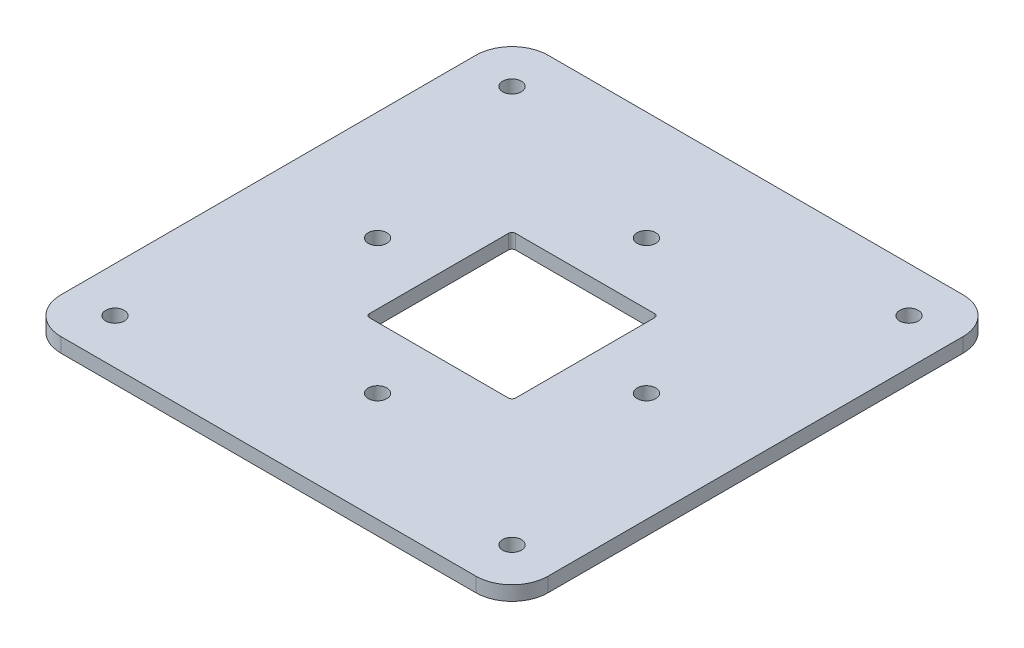
ISO-10303-21;
HEADER;
FILE_DESCRIPTION(('STEP AP214'),'2;1');
FILE_NAME('part.step','',(''),(''),'','','');
FILE_SCHEMA(('AUTOMOTIVE_DESIGN { 1 0 10303 214 1 1 1 1 }'));
ENDSEC;
DATA;
#1=APPLICATION_CONTEXT('core data for automotive mechanical design processes');
#2=APPLICATION_PROTOCOL_DEFINITION('international standard','automotive_design',2000,#1);
#3=PRODUCT_CONTEXT('',#1,'mechanical');
#4=PRODUCT('Part','Part','',(#3));
#5=PRODUCT_RELATED_PRODUCT_CATEGORY('part','',(#4));
#6=PRODUCT_DEFINITION_FORMATION('','',#4);
#7=PRODUCT_DEFINITION_CONTEXT('part definition',#1,'design');
#8=PRODUCT_DEFINITION('design','',#6,#7);
#9=PRODUCT_DEFINITION_SHAPE('','',#8);
#10=(LENGTH_UNIT() NAMED_UNIT(*) SI_UNIT(.MILLI.,.METRE.));
#11=(NAMED_UNIT(*) PLANE_ANGLE_UNIT() SI_UNIT($,.RADIAN.));
#12=(NAMED_UNIT(*) SI_UNIT($,.STERADIAN.) SOLID_ANGLE_UNIT());
#13=UNCERTAINTY_MEASURE_WITH_UNIT(LENGTH_MEASURE(1.E-05),#10,'distance_accuracy_value','');
#14=(GEOMETRIC_REPRESENTATION_CONTEXT(3) GLOBAL_UNCERTAINTY_ASSIGNED_CONTEXT((#13)) GLOBAL_UNIT_ASSIGNED_CONTEXT((#10,
#11,#12)) REPRESENTATION_CONTEXT('',''));
#15=CARTESIAN_POINT('',(0.,0.,0.));
#16=DIRECTION('',(0.,0.,1.));
#17=DIRECTION('',(1.,0.,0.));
#18=AXIS2_PLACEMENT_3D('',#15,#16,#17);
#19=CARTESIAN_POINT('',(67.5,4.,-67.5));
#20=DIRECTION('',(-1.,0.,0.));
#21=DIRECTION('',(0.,0.,1.));
#22=AXIS2_PLACEMENT_3D('',#19,#20,#21);
#23=PLANE('',#22);
#24=DIRECTION('',(0.,0.,-1.));
#25=VECTOR('',#24,1.);
#26=CARTESIAN_POINT('',(67.5,0.,-67.5));
#27=LINE('',#26,#25);
#28=CARTESIAN_POINT('',(67.5,0.,57.5));
#29=VERTEX_POINT('',#28);
#30=CARTESIAN_POINT('',(67.5,0.,-57.5));
#31=VERTEX_POINT('',#30);
#32=EDGE_CURVE('E240',#29,#31,#27,.T.);
#33=ORIENTED_EDGE('',*,*,#32,.T.);
#34=DIRECTION('',(0.,-1.,0.));
#35=VECTOR('',#34,1.);
#36=CARTESIAN_POINT('',(67.5,4.,-57.5));
#37=LINE('',#36,#35);
#38=CARTESIAN_POINT('',(67.5,4.,-57.5));
#39=VERTEX_POINT('',#38);
#40=EDGE_CURVE('E309',#31,#39,#37,.F.);
#41=ORIENTED_EDGE('',*,*,#40,.T.);
#42=DIRECTION('',(0.,0.,-1.));
#43=VECTOR('',#42,1.);
#44=CARTESIAN_POINT('',(67.5,4.,-67.5));
#45=LINE('',#44,#43);
#46=CARTESIAN_POINT('',(67.5,4.,57.5));
#47=VERTEX_POINT('',#46);
#48=EDGE_CURVE('E258',#47,#39,#45,.T.);
#49=ORIENTED_EDGE('',*,*,#48,.F.);
#50=DIRECTION('',(0.,-1.,0.));
#51=VECTOR('',#50,1.);
#52=CARTESIAN_POINT('',(67.5,4.,57.5));
#53=LINE('',#52,#51);
#54=EDGE_CURVE('E305',#47,#29,#53,.T.);
#55=ORIENTED_EDGE('',*,*,#54,.T.);
#56=EDGE_LOOP('',(#33,#41,#49,#55));
#57=FACE_BOUND('',#56,.T.);
#58=ADVANCED_FACE('F39',(#57),#23,.F.);
#59=CARTESIAN_POINT('',(-67.5,4.,-67.5));
#60=DIRECTION('',(0.,0.,1.));
#61=DIRECTION('',(1.,0.,0.));
#62=AXIS2_PLACEMENT_3D('',#59,#60,#61);
#63=PLANE('',#62);
#64=DIRECTION('',(-1.,0.,0.));
#65=VECTOR('',#64,1.);
#66=CARTESIAN_POINT('',(-67.5,4.,-67.5));
#67=LINE('',#66,#65);
#68=CARTESIAN_POINT('',(57.5,4.,-67.5));
#69=VERTEX_POINT('',#68);
#70=CARTESIAN_POINT('',(-57.5,4.,-67.5));
#71=VERTEX_POINT('',#70);
#72=EDGE_CURVE('E262',#69,#71,#67,.T.);
#73=ORIENTED_EDGE('',*,*,#72,.F.);
#74=DIRECTION('',(0.,-1.,0.));
#75=VECTOR('',#74,1.);
#76=CARTESIAN_POINT('',(57.5,4.,-67.5));
#77=LINE('',#76,#75);
#78=CARTESIAN_POINT('',(57.5,0.,-67.5));
#79=VERTEX_POINT('',#78);
#80=EDGE_CURVE('E289',#69,#79,#77,.T.);
#81=ORIENTED_EDGE('',*,*,#80,.T.);
#82=DIRECTION('',(-1.,0.,0.));
#83=VECTOR('',#82,1.);
#84=CARTESIAN_POINT('',(-67.5,0.,-67.5));
#85=LINE('',#84,#83);
#86=CARTESIAN_POINT('',(-57.5,0.,-67.5));
#87=VERTEX_POINT('',#86);
#88=EDGE_CURVE('E277',#79,#87,#85,.T.);
#89=ORIENTED_EDGE('',*,*,#88,.T.);
#90=DIRECTION('',(0.,-1.,0.));
#91=VECTOR('',#90,1.);
#92=CARTESIAN_POINT('',(-57.5,4.,-67.5));
#93=LINE('',#92,#91);
#94=EDGE_CURVE('E273',#87,#71,#93,.F.);
#95=ORIENTED_EDGE('',*,*,#94,.T.);
#96=EDGE_LOOP('',(#73,#81,#89,#95));
#97=FACE_BOUND('',#96,.T.);
#98=ADVANCED_FACE('F359',(#97),#63,.F.);
#99=CARTESIAN_POINT('',(-67.5,4.,-67.5));
#100=DIRECTION('',(1.,0.,0.));
#101=DIRECTION('',(0.,0.,-1.));
#102=AXIS2_PLACEMENT_3D('',#99,#100,#101);
#103=PLANE('',#102);
#104=DIRECTION('',(0.,0.,1.));
#105=VECTOR('',#104,1.);
#106=CARTESIAN_POINT('',(-67.5,0.,-67.5));
#107=LINE('',#106,#105);
#108=CARTESIAN_POINT('',(-67.5,0.,-57.5));
#109=VERTEX_POINT('',#108);
#110=CARTESIAN_POINT('',(-67.5,0.,57.5));
#111=VERTEX_POINT('',#110);
#112=EDGE_CURVE('E281',#109,#111,#107,.T.);
#113=ORIENTED_EDGE('',*,*,#112,.T.);
#114=DIRECTION('',(0.,-1.,0.));
#115=VECTOR('',#114,1.);
#116=CARTESIAN_POINT('',(-67.5,4.,57.5));
#117=LINE('',#116,#115);
#118=CARTESIAN_POINT('',(-67.5,4.,57.5));
#119=VERTEX_POINT('',#118);
#120=EDGE_CURVE('E11',#111,#119,#117,.F.);
#121=ORIENTED_EDGE('',*,*,#120,.T.);
#122=DIRECTION('',(0.,0.,1.));
#123=VECTOR('',#122,1.);
#124=CARTESIAN_POINT('',(-67.5,4.,-67.5));
#125=LINE('',#124,#123);
#126=CARTESIAN_POINT('',(-67.5,4.,-57.5));
#127=VERTEX_POINT('',#126);
#128=EDGE_CURVE('E267',#127,#119,#125,.T.);
#129=ORIENTED_EDGE('',*,*,#128,.F.);
#130=DIRECTION('',(0.,-1.,0.));
#131=VECTOR('',#130,1.);
#132=CARTESIAN_POINT('',(-67.5,4.,-57.5));
#133=LINE('',#132,#131);
#134=EDGE_CURVE('E48',#127,#109,#133,.T.);
#135=ORIENTED_EDGE('',*,*,#134,.T.);
#136=EDGE_LOOP('',(#113,#121,#129,#135));
#137=FACE_BOUND('',#136,.T.);
#138=ADVANCED_FACE('F334',(#137),#103,.F.);
#139=CARTESIAN_POINT('',(-67.5,4.,67.5));
#140=DIRECTION('',(0.,0.,-1.));
#141=DIRECTION('',(-1.,0.,0.));
#142=AXIS2_PLACEMENT_3D('',#139,#140,#141);
#143=PLANE('',#142);
#144=DIRECTION('',(1.,0.,0.));
#145=VECTOR('',#144,1.);
#146=CARTESIAN_POINT('',(-67.5,0.,67.5));
#147=LINE('',#146,#145);
#148=CARTESIAN_POINT('',(-57.5,0.,67.5));
#149=VERTEX_POINT('',#148);
#150=CARTESIAN_POINT('',(57.5,0.,67.5));
#151=VERTEX_POINT('',#150);
#152=EDGE_CURVE('E263',#149,#151,#147,.T.);
#153=ORIENTED_EDGE('',*,*,#152,.T.);
#154=DIRECTION('',(0.,-1.,0.));
#155=VECTOR('',#154,1.);
#156=CARTESIAN_POINT('',(57.5,4.,67.5));
#157=LINE('',#156,#155);
#158=CARTESIAN_POINT('',(57.5,4.,67.5));
#159=VERTEX_POINT('',#158);
#160=EDGE_CURVE('E55',#151,#159,#157,.F.);
#161=ORIENTED_EDGE('',*,*,#160,.T.);
#162=DIRECTION('',(1.,0.,0.));
#163=VECTOR('',#162,1.);
#164=CARTESIAN_POINT('',(-67.5,4.,67.5));
#165=LINE('',#164,#163);
#166=CARTESIAN_POINT('',(-57.5,4.,67.5));
#167=VERTEX_POINT('',#166);
#168=EDGE_CURVE('E270',#167,#159,#165,.T.);
#169=ORIENTED_EDGE('',*,*,#168,.F.);
#170=DIRECTION('',(0.,-1.,0.));
#171=VECTOR('',#170,1.);
#172=CARTESIAN_POINT('',(-57.5,4.,67.5));
#173=LINE('',#172,#171);
#174=EDGE_CURVE('E323',#167,#149,#173,.T.);
#175=ORIENTED_EDGE('',*,*,#174,.T.);
#176=EDGE_LOOP('',(#153,#161,#169,#175));
#177=FACE_BOUND('',#176,.T.);
#178=ADVANCED_FACE('F343',(#177),#143,.F.);
#179=CARTESIAN_POINT('',(0.,4.,0.));
#180=DIRECTION('',(0.,1.,0.));
#181=DIRECTION('',(0.,0.,1.));
#182=AXIS2_PLACEMENT_3D('',#179,#180,#181);
#183=PLANE('',#182);
#184=CARTESIAN_POINT('',(-54.9999999999989,4.,55.));
#185=DIRECTION('',(0.,1.,0.));
#186=DIRECTION('',(0.,0.,1.));
#187=AXIS2_PLACEMENT_3D('',#184,#185,#186);
#188=CIRCLE('',#187,2.58);
#189=CARTESIAN_POINT('',(-54.9999999999989,4.,57.58));
#190=VERTEX_POINT('',#189);
#191=EDGE_CURVE('E600',#190,#190,#188,.T.);
#192=ORIENTED_EDGE('',*,*,#191,.F.);
#193=EDGE_LOOP('',(#192));
#194=FACE_BOUND('',#193,.T.);
#195=CARTESIAN_POINT('',(55.0000000000011,4.,55.));
#196=DIRECTION('',(0.,1.,0.));
#197=DIRECTION('',(0.,0.,1.));
#198=AXIS2_PLACEMENT_3D('',#195,#196,#197);
#199=CIRCLE('',#198,2.58);
#200=CARTESIAN_POINT('',(55.0000000000011,4.,57.58));
#201=VERTEX_POINT('',#200);
#202=EDGE_CURVE('E604',#201,#201,#199,.T.);
#203=ORIENTED_EDGE('',*,*,#202,.F.);
#204=EDGE_LOOP('',(#203));
#205=FACE_BOUND('',#204,.T.);
#206=CARTESIAN_POINT('',(55.,4.,-55.));
#207=DIRECTION('',(0.,1.,0.));
#208=DIRECTION('',(0.,0.,1.));
#209=AXIS2_PLACEMENT_3D('',#206,#207,#208);
#210=CIRCLE('',#209,2.58);
#211=CARTESIAN_POINT('',(55.,4.,-52.42));
#212=VERTEX_POINT('',#211);
#213=EDGE_CURVE('E608',#212,#212,#210,.T.);
#214=ORIENTED_EDGE('',*,*,#213,.F.);
#215=EDGE_LOOP('',(#214));
#216=FACE_BOUND('',#215,.T.);
#217=CARTESIAN_POINT('',(-55.,4.,-55.));
#218=DIRECTION('',(0.,1.,0.));
#219=DIRECTION('',(0.,0.,1.));
#220=AXIS2_PLACEMENT_3D('',#217,#218,#219);
#221=CIRCLE('',#220,2.58);
#222=CARTESIAN_POINT('',(-55.,4.,-52.42));
#223=VERTEX_POINT('',#222);
#224=EDGE_CURVE('E612',#223,#223,#221,.T.);
#225=ORIENTED_EDGE('',*,*,#224,.F.);
#226=EDGE_LOOP('',(#225));
#227=FACE_BOUND('',#226,.T.);
#228=CARTESIAN_POINT('',(-37.25,4.,0.));
#229=DIRECTION('',(0.,1.,0.));
#230=DIRECTION('',(0.,0.,1.));
#231=AXIS2_PLACEMENT_3D('',#228,#229,#230);
#232=CIRCLE('',#231,2.58);
#233=CARTESIAN_POINT('',(-37.25,4.,2.58));
#234=VERTEX_POINT('',#233);
#235=EDGE_CURVE('E616',#234,#234,#232,.T.);
#236=ORIENTED_EDGE('',*,*,#235,.F.);
#237=EDGE_LOOP('',(#236));
#238=FACE_BOUND('',#237,.T.);
#239=CARTESIAN_POINT('',(1.25495870545083E-13,4.,-37.25));
#240=DIRECTION('',(0.,1.,0.));
#241=DIRECTION('',(0.,0.,1.));
#242=AXIS2_PLACEMENT_3D('',#239,#240,#241);
#243=CIRCLE('',#242,2.58);
#244=CARTESIAN_POINT('',(1.25495870545083E-13,4.,-34.67));
#245=VERTEX_POINT('',#244);
#246=EDGE_CURVE('E620',#245,#245,#243,.T.);
#247=ORIENTED_EDGE('',*,*,#246,.F.);
#248=EDGE_LOOP('',(#247));
#249=FACE_BOUND('',#248,.T.);
#250=CARTESIAN_POINT('',(37.25,4.,2.55553550416989E-13));
#251=DIRECTION('',(0.,1.,0.));
#252=DIRECTION('',(0.,0.,1.));
#253=AXIS2_PLACEMENT_3D('',#250,#251,#252);
#254=CIRCLE('',#253,2.58);
#255=CARTESIAN_POINT('',(37.25,4.,2.58000000000025));
#256=VERTEX_POINT('',#255);
#257=EDGE_CURVE('E624',#256,#256,#254,.T.);
#258=ORIENTED_EDGE('',*,*,#257,.F.);
#259=EDGE_LOOP('',(#258));
#260=FACE_BOUND('',#259,.T.);
#261=CARTESIAN_POINT('',(-3.92550124192803E-13,4.,37.25));
#262=DIRECTION('',(0.,1.,0.));
#263=DIRECTION('',(0.,0.,1.));
#264=AXIS2_PLACEMENT_3D('',#261,#262,#263);
#265=CIRCLE('',#264,2.58);
#266=CARTESIAN_POINT('',(-3.92550124192803E-13,4.,39.83));
#267=VERTEX_POINT('',#266);
#268=EDGE_CURVE('E190',#267,#267,#265,.T.);
#269=ORIENTED_EDGE('',*,*,#268,.F.);
#270=EDGE_LOOP('',(#269));
#271=FACE_BOUND('',#270,.T.);
#272=CARTESIAN_POINT('',(-19.25,4.,19.25));
#273=DIRECTION('',(0.,1.,0.));
#274=DIRECTION('',(0.,0.,1.));
#275=AXIS2_PLACEMENT_3D('',#272,#273,#274);
#276=CIRCLE('',#275,1.);
#277=CARTESIAN_POINT('',(-20.25,4.,19.25));
#278=VERTEX_POINT('',#277);
#279=CARTESIAN_POINT('',(-19.25,4.,20.25));
#280=VERTEX_POINT('',#279);
#281=EDGE_CURVE('E161',#278,#280,#276,.T.);
#282=ORIENTED_EDGE('',*,*,#281,.F.);
#283=DIRECTION('',(0.,0.,1.));
#284=VECTOR('',#283,1.);
#285=CARTESIAN_POINT('',(-20.25,4.,-19.25));
#286=LINE('',#285,#284);
#287=CARTESIAN_POINT('',(-20.25,4.,-19.25));
#288=VERTEX_POINT('',#287);
#289=EDGE_CURVE('E183',#288,#278,#286,.T.);
#290=ORIENTED_EDGE('',*,*,#289,.F.);
#291=CARTESIAN_POINT('',(-19.25,4.,-19.25));
#292=DIRECTION('',(0.,1.,0.));
#293=DIRECTION('',(0.,0.,1.));
#294=AXIS2_PLACEMENT_3D('',#291,#292,#293);
#295=CIRCLE('',#294,1.);
#296=CARTESIAN_POINT('',(-19.25,4.,-20.25));
#297=VERTEX_POINT('',#296);
#298=EDGE_CURVE('E187',#297,#288,#295,.T.);
#299=ORIENTED_EDGE('',*,*,#298,.F.);
#300=DIRECTION('',(-1.,0.,0.));
#301=VECTOR('',#300,1.);
#302=CARTESIAN_POINT('',(-19.25,4.,-20.25));
#303=LINE('',#302,#301);
#304=CARTESIAN_POINT('',(19.25,4.,-20.25));
#305=VERTEX_POINT('',#304);
#306=EDGE_CURVE('E230',#305,#297,#303,.T.);
#307=ORIENTED_EDGE('',*,*,#306,.F.);
#308=CARTESIAN_POINT('',(19.25,4.,-19.25));
#309=DIRECTION('',(0.,1.,0.));
#310=DIRECTION('',(0.,0.,-1.));
#311=AXIS2_PLACEMENT_3D('',#308,#309,#310);
#312=CIRCLE('',#311,1.);
#313=CARTESIAN_POINT('',(20.25,4.,-19.25));
#314=VERTEX_POINT('',#313);
#315=EDGE_CURVE('E226',#314,#305,#312,.T.);
#316=ORIENTED_EDGE('',*,*,#315,.F.);
#317=DIRECTION('',(0.,0.,-1.));
#318=VECTOR('',#317,1.);
#319=CARTESIAN_POINT('',(20.25,4.,-19.25));
#320=LINE('',#319,#318);
#321=CARTESIAN_POINT('',(20.25,4.,19.25));
#322=VERTEX_POINT('',#321);
#323=EDGE_CURVE('E222',#322,#314,#320,.T.);
#324=ORIENTED_EDGE('',*,*,#323,.F.);
#325=CARTESIAN_POINT('',(19.25,4.,19.25));
#326=DIRECTION('',(0.,1.,0.));
#327=DIRECTION('',(0.,0.,1.));
#328=AXIS2_PLACEMENT_3D('',#325,#326,#327);
#329=CIRCLE('',#328,1.);
#330=CARTESIAN_POINT('',(19.25,4.,20.25));
#331=VERTEX_POINT('',#330);
#332=EDGE_CURVE('E218',#331,#322,#329,.T.);
#333=ORIENTED_EDGE('',*,*,#332,.F.);
#334=DIRECTION('',(1.,0.,0.));
#335=VECTOR('',#334,1.);
#336=CARTESIAN_POINT('',(-19.25,4.,20.25));
#337=LINE('',#336,#335);
#338=EDGE_CURVE('E214',#280,#331,#337,.T.);
#339=ORIENTED_EDGE('',*,*,#338,.F.);
#340=EDGE_LOOP('',(#282,#290,#299,#307,#316,#324,#333,#339));
#341=FACE_BOUND('',#340,.T.);
#342=ORIENTED_EDGE('',*,*,#48,.T.);
#343=CARTESIAN_POINT('',(57.5,4.,-57.5));
#344=DIRECTION('',(0.,1.,0.));
#345=DIRECTION('',(0.,0.,1.));
#346=AXIS2_PLACEMENT_3D('',#343,#344,#345);
#347=CIRCLE('',#346,10.);
#348=EDGE_CURVE('E320',#39,#69,#347,.T.);
#349=ORIENTED_EDGE('',*,*,#348,.T.);
#350=ORIENTED_EDGE('',*,*,#72,.T.);
#351=CARTESIAN_POINT('',(-57.5,4.,-57.5));
#352=DIRECTION('',(0.,1.,0.));
#353=DIRECTION('',(0.,0.,1.));
#354=AXIS2_PLACEMENT_3D('',#351,#352,#353);
#355=CIRCLE('',#354,10.);
#356=EDGE_CURVE('E312',#71,#127,#355,.T.);
#357=ORIENTED_EDGE('',*,*,#356,.T.);
#358=ORIENTED_EDGE('',*,*,#128,.T.);
#359=CARTESIAN_POINT('',(-57.5,4.,57.5));
#360=DIRECTION('',(0.,1.,0.));
#361=DIRECTION('',(0.,0.,1.));
#362=AXIS2_PLACEMENT_3D('',#359,#360,#361);
#363=CIRCLE('',#362,10.);
#364=EDGE_CURVE('E62',#119,#167,#363,.T.);
#365=ORIENTED_EDGE('',*,*,#364,.T.);
#366=ORIENTED_EDGE('',*,*,#168,.T.);
#367=CARTESIAN_POINT('',(57.5,4.,57.5));
#368=DIRECTION('',(0.,1.,0.));
#369=DIRECTION('',(0.,0.,1.));
#370=AXIS2_PLACEMENT_3D('',#367,#368,#369);
#371=CIRCLE('',#370,10.);
#372=EDGE_CURVE('E317',#159,#47,#371,.T.);
#373=ORIENTED_EDGE('',*,*,#372,.T.);
#374=EDGE_LOOP('',(#342,#349,#350,#357,#358,#365,#366,#373));
#375=FACE_BOUND('',#374,.T.);
#376=ADVANCED_FACE('F345',(#194,#205,#216,#227,#238,#249,#260,#271,#341,#375),#183,.T.);
#377=CARTESIAN_POINT('',(0.,0.,0.));
#378=DIRECTION('',(0.,1.,0.));
#379=DIRECTION('',(0.,0.,1.));
#380=AXIS2_PLACEMENT_3D('',#377,#378,#379);
#381=PLANE('',#380);
#382=CARTESIAN_POINT('',(-54.9999999999989,0.,55.));
#383=DIRECTION('',(0.,1.,0.));
#384=DIRECTION('',(0.,0.,1.));
#385=AXIS2_PLACEMENT_3D('',#382,#383,#384);
#386=CIRCLE('',#385,2.58);
#387=CARTESIAN_POINT('',(-54.9999999999989,0.,57.58));
#388=VERTEX_POINT('',#387);
#389=EDGE_CURVE('E683',#388,#388,#386,.T.);
#390=ORIENTED_EDGE('',*,*,#389,.T.);
#391=EDGE_LOOP('',(#390));
#392=FACE_BOUND('',#391,.T.);
#393=CARTESIAN_POINT('',(55.0000000000011,0.,55.));
#394=DIRECTION('',(0.,1.,0.));
#395=DIRECTION('',(0.,0.,1.));
#396=AXIS2_PLACEMENT_3D('',#393,#394,#395);
#397=CIRCLE('',#396,2.58);
#398=CARTESIAN_POINT('',(55.0000000000011,0.,57.58));
#399=VERTEX_POINT('',#398);
#400=EDGE_CURVE('E689',#399,#399,#397,.T.);
#401=ORIENTED_EDGE('',*,*,#400,.T.);
#402=EDGE_LOOP('',(#401));
#403=FACE_BOUND('',#402,.T.);
#404=CARTESIAN_POINT('',(55.,0.,-55.));
#405=DIRECTION('',(0.,1.,0.));
#406=DIRECTION('',(0.,0.,1.));
#407=AXIS2_PLACEMENT_3D('',#404,#405,#406);
#408=CIRCLE('',#407,2.58);
#409=CARTESIAN_POINT('',(55.,0.,-52.42));
#410=VERTEX_POINT('',#409);
#411=EDGE_CURVE('E650',#410,#410,#408,.T.);
#412=ORIENTED_EDGE('',*,*,#411,.T.);
#413=EDGE_LOOP('',(#412));
#414=FACE_BOUND('',#413,.T.);
#415=CARTESIAN_POINT('',(-55.,0.,-55.));
#416=DIRECTION('',(0.,1.,0.));
#417=DIRECTION('',(0.,0.,1.));
#418=AXIS2_PLACEMENT_3D('',#415,#416,#417);
#419=CIRCLE('',#418,2.58);
#420=CARTESIAN_POINT('',(-55.,0.,-52.42));
#421=VERTEX_POINT('',#420);
#422=EDGE_CURVE('E641',#421,#421,#419,.T.);
#423=ORIENTED_EDGE('',*,*,#422,.T.);
#424=EDGE_LOOP('',(#423));
#425=FACE_BOUND('',#424,.T.);
#426=CARTESIAN_POINT('',(-37.25,0.,0.));
#427=DIRECTION('',(0.,1.,0.));
#428=DIRECTION('',(0.,0.,1.));
#429=AXIS2_PLACEMENT_3D('',#426,#427,#428);
#430=CIRCLE('',#429,2.58);
#431=CARTESIAN_POINT('',(-37.25,0.,2.58));
#432=VERTEX_POINT('',#431);
#433=EDGE_CURVE('E215',#432,#432,#430,.T.);
#434=ORIENTED_EDGE('',*,*,#433,.T.);
#435=EDGE_LOOP('',(#434));
#436=FACE_BOUND('',#435,.T.);
#437=CARTESIAN_POINT('',(1.25495870545083E-13,0.,-37.25));
#438=DIRECTION('',(0.,1.,0.));
#439=DIRECTION('',(0.,0.,1.));
#440=AXIS2_PLACEMENT_3D('',#437,#438,#439);
#441=CIRCLE('',#440,2.58);
#442=CARTESIAN_POINT('',(1.25495870545083E-13,0.,-34.67));
#443=VERTEX_POINT('',#442);
#444=EDGE_CURVE('E660',#443,#443,#441,.T.);
#445=ORIENTED_EDGE('',*,*,#444,.T.);
#446=EDGE_LOOP('',(#445));
#447=FACE_BOUND('',#446,.T.);
#448=CARTESIAN_POINT('',(37.25,0.,2.55553550416989E-13));
#449=DIRECTION('',(0.,1.,0.));
#450=DIRECTION('',(0.,0.,1.));
#451=AXIS2_PLACEMENT_3D('',#448,#449,#450);
#452=CIRCLE('',#451,2.58);
#453=CARTESIAN_POINT('',(37.25,0.,2.58000000000025));
#454=VERTEX_POINT('',#453);
#455=EDGE_CURVE('E666',#454,#454,#452,.T.);
#456=ORIENTED_EDGE('',*,*,#455,.T.);
#457=EDGE_LOOP('',(#456));
#458=FACE_BOUND('',#457,.T.);
#459=CARTESIAN_POINT('',(-3.92550124192803E-13,0.,37.25));
#460=DIRECTION('',(0.,1.,0.));
#461=DIRECTION('',(0.,0.,1.));
#462=AXIS2_PLACEMENT_3D('',#459,#460,#461);
#463=CIRCLE('',#462,2.58);
#464=CARTESIAN_POINT('',(-3.92550124192803E-13,0.,39.83));
#465=VERTEX_POINT('',#464);
#466=EDGE_CURVE('E640',#465,#465,#463,.T.);
#467=ORIENTED_EDGE('',*,*,#466,.T.);
#468=EDGE_LOOP('',(#467));
#469=FACE_BOUND('',#468,.T.);
#470=DIRECTION('',(0.,0.,1.));
#471=VECTOR('',#470,1.);
#472=CARTESIAN_POINT('',(-20.25,0.,-19.25));
#473=LINE('',#472,#471);
#474=CARTESIAN_POINT('',(-20.25,0.,-19.25));
#475=VERTEX_POINT('',#474);
#476=CARTESIAN_POINT('',(-20.25,0.,19.25));
#477=VERTEX_POINT('',#476);
#478=EDGE_CURVE('E167',#475,#477,#473,.T.);
#479=ORIENTED_EDGE('',*,*,#478,.T.);
#480=CARTESIAN_POINT('',(-19.25,0.,19.25));
#481=DIRECTION('',(0.,1.,0.));
#482=DIRECTION('',(0.,0.,1.));
#483=AXIS2_PLACEMENT_3D('',#480,#481,#482);
#484=CIRCLE('',#483,1.);
#485=CARTESIAN_POINT('',(-19.25,0.,20.25));
#486=VERTEX_POINT('',#485);
#487=EDGE_CURVE('E158',#477,#486,#484,.T.);
#488=ORIENTED_EDGE('',*,*,#487,.T.);
#489=DIRECTION('',(1.,0.,0.));
#490=VECTOR('',#489,1.);
#491=CARTESIAN_POINT('',(-19.25,0.,20.25));
#492=LINE('',#491,#490);
#493=CARTESIAN_POINT('',(19.25,0.,20.25));
#494=VERTEX_POINT('',#493);
#495=EDGE_CURVE('E171',#486,#494,#492,.T.);
#496=ORIENTED_EDGE('',*,*,#495,.T.);
#497=CARTESIAN_POINT('',(19.25,0.,19.25));
#498=DIRECTION('',(0.,1.,0.));
#499=DIRECTION('',(0.,0.,1.));
#500=AXIS2_PLACEMENT_3D('',#497,#498,#499);
#501=CIRCLE('',#500,1.);
#502=CARTESIAN_POINT('',(20.25,0.,19.25));
#503=VERTEX_POINT('',#502);
#504=EDGE_CURVE('E176',#494,#503,#501,.T.);
#505=ORIENTED_EDGE('',*,*,#504,.T.);
#506=DIRECTION('',(0.,0.,-1.));
#507=VECTOR('',#506,1.);
#508=CARTESIAN_POINT('',(20.25,0.,-19.25));
#509=LINE('',#508,#507);
#510=CARTESIAN_POINT('',(20.25,0.,-19.25));
#511=VERTEX_POINT('',#510);
#512=EDGE_CURVE('E195',#503,#511,#509,.T.);
#513=ORIENTED_EDGE('',*,*,#512,.T.);
#514=CARTESIAN_POINT('',(19.25,0.,-19.25));
#515=DIRECTION('',(0.,1.,0.));
#516=DIRECTION('',(0.,0.,-1.));
#517=AXIS2_PLACEMENT_3D('',#514,#515,#516);
#518=CIRCLE('',#517,1.);
#519=CARTESIAN_POINT('',(19.25,0.,-20.25));
#520=VERTEX_POINT('',#519);
#521=EDGE_CURVE('E199',#511,#520,#518,.T.);
#522=ORIENTED_EDGE('',*,*,#521,.T.);
#523=DIRECTION('',(-1.,0.,0.));
#524=VECTOR('',#523,1.);
#525=CARTESIAN_POINT('',(-19.25,0.,-20.25));
#526=LINE('',#525,#524);
#527=CARTESIAN_POINT('',(-19.25,0.,-20.25));
#528=VERTEX_POINT('',#527);
#529=EDGE_CURVE('E203',#520,#528,#526,.T.);
#530=ORIENTED_EDGE('',*,*,#529,.T.);
#531=CARTESIAN_POINT('',(-19.25,0.,-19.25));
#532=DIRECTION('',(0.,1.,0.));
#533=DIRECTION('',(0.,0.,1.));
#534=AXIS2_PLACEMENT_3D('',#531,#532,#533);
#535=CIRCLE('',#534,1.);
#536=EDGE_CURVE('E207',#528,#475,#535,.T.);
#537=ORIENTED_EDGE('',*,*,#536,.T.);
#538=EDGE_LOOP('',(#479,#488,#496,#505,#513,#522,#530,#537));
#539=FACE_BOUND('',#538,.T.);
#540=ORIENTED_EDGE('',*,*,#88,.F.);
#541=CARTESIAN_POINT('',(57.5,0.,-57.5));
#542=DIRECTION('',(0.,1.,0.));
#543=DIRECTION('',(0.,0.,1.));
#544=AXIS2_PLACEMENT_3D('',#541,#542,#543);
#545=CIRCLE('',#544,10.);
#546=EDGE_CURVE('E302',#79,#31,#545,.F.);
#547=ORIENTED_EDGE('',*,*,#546,.T.);
#548=ORIENTED_EDGE('',*,*,#32,.F.);
#549=CARTESIAN_POINT('',(57.5,0.,57.5));
#550=DIRECTION('',(0.,1.,0.));
#551=DIRECTION('',(0.,0.,1.));
#552=AXIS2_PLACEMENT_3D('',#549,#550,#551);
#553=CIRCLE('',#552,10.);
#554=EDGE_CURVE('E299',#29,#151,#553,.F.);
#555=ORIENTED_EDGE('',*,*,#554,.T.);
#556=ORIENTED_EDGE('',*,*,#152,.F.);
#557=CARTESIAN_POINT('',(-57.5,0.,57.5));
#558=DIRECTION('',(0.,1.,0.));
#559=DIRECTION('',(0.,0.,1.));
#560=AXIS2_PLACEMENT_3D('',#557,#558,#559);
#561=CIRCLE('',#560,10.);
#562=EDGE_CURVE('E296',#149,#111,#561,.F.);
#563=ORIENTED_EDGE('',*,*,#562,.T.);
#564=ORIENTED_EDGE('',*,*,#112,.F.);
#565=CARTESIAN_POINT('',(-57.5,0.,-57.5));
#566=DIRECTION('',(0.,1.,0.));
#567=DIRECTION('',(0.,0.,1.));
#568=AXIS2_PLACEMENT_3D('',#565,#566,#567);
#569=CIRCLE('',#568,10.);
#570=EDGE_CURVE('E293',#109,#87,#569,.F.);
#571=ORIENTED_EDGE('',*,*,#570,.T.);
#572=EDGE_LOOP('',(#540,#547,#548,#555,#556,#563,#564,#571));
#573=FACE_BOUND('',#572,.T.);
#574=ADVANCED_FACE('F178',(#392,#403,#414,#425,#436,#447,#458,#469,#539,#573),#381,.F.);
#575=CARTESIAN_POINT('',(-19.25,0.,19.25));
#576=DIRECTION('',(0.,1.,0.));
#577=DIRECTION('',(0.,0.,1.));
#578=AXIS2_PLACEMENT_3D('',#575,#576,#577);
#579=CYLINDRICAL_SURFACE('',#578,1.);
#580=ORIENTED_EDGE('',*,*,#281,.T.);
#581=DIRECTION('',(0.,1.,0.));
#582=VECTOR('',#581,1.);
#583=CARTESIAN_POINT('',(-19.25,0.,20.25));
#584=LINE('',#583,#582);
#585=EDGE_CURVE('E154',#486,#280,#584,.T.);
#586=ORIENTED_EDGE('',*,*,#585,.F.);
#587=ORIENTED_EDGE('',*,*,#487,.F.);
#588=DIRECTION('',(0.,1.,0.));
#589=VECTOR('',#588,1.);
#590=CARTESIAN_POINT('',(-20.25,0.,19.25));
#591=LINE('',#590,#589);
#592=EDGE_CURVE('E237',#477,#278,#591,.T.);
#593=ORIENTED_EDGE('',*,*,#592,.T.);
#594=EDGE_LOOP('',(#580,#586,#587,#593));
#595=FACE_BOUND('',#594,.T.);
#596=ADVANCED_FACE('F156',(#595),#579,.F.);
#597=CARTESIAN_POINT('',(-20.25,0.,-19.25));
#598=DIRECTION('',(-1.,0.,0.));
#599=DIRECTION('',(0.,0.,1.));
#600=AXIS2_PLACEMENT_3D('',#597,#598,#599);
#601=PLANE('',#600);
#602=ORIENTED_EDGE('',*,*,#289,.T.);
#603=ORIENTED_EDGE('',*,*,#592,.F.);
#604=ORIENTED_EDGE('',*,*,#478,.F.);
#605=DIRECTION('',(0.,1.,0.));
#606=VECTOR('',#605,1.);
#607=CARTESIAN_POINT('',(-20.25,0.,-19.25));
#608=LINE('',#607,#606);
#609=EDGE_CURVE('E241',#475,#288,#608,.T.);
#610=ORIENTED_EDGE('',*,*,#609,.T.);
#611=EDGE_LOOP('',(#602,#603,#604,#610));
#612=FACE_BOUND('',#611,.T.);
#613=ADVANCED_FACE('F521',(#612),#601,.F.);
#614=CARTESIAN_POINT('',(-19.25,0.,-19.25));
#615=DIRECTION('',(0.,1.,0.));
#616=DIRECTION('',(0.,0.,1.));
#617=AXIS2_PLACEMENT_3D('',#614,#615,#616);
#618=CYLINDRICAL_SURFACE('',#617,1.);
#619=ORIENTED_EDGE('',*,*,#298,.T.);
#620=ORIENTED_EDGE('',*,*,#609,.F.);
#621=ORIENTED_EDGE('',*,*,#536,.F.);
#622=DIRECTION('',(0.,1.,0.));
#623=VECTOR('',#622,1.);
#624=CARTESIAN_POINT('',(-19.25,0.,-20.25));
#625=LINE('',#624,#623);
#626=EDGE_CURVE('E244',#528,#297,#625,.T.);
#627=ORIENTED_EDGE('',*,*,#626,.T.);
#628=EDGE_LOOP('',(#619,#620,#621,#627));
#629=FACE_BOUND('',#628,.T.);
#630=ADVANCED_FACE('F512',(#629),#618,.F.);
#631=CARTESIAN_POINT('',(-19.25,0.,-20.25));
#632=DIRECTION('',(0.,0.,-1.));
#633=DIRECTION('',(-1.,0.,0.));
#634=AXIS2_PLACEMENT_3D('',#631,#632,#633);
#635=PLANE('',#634);
#636=ORIENTED_EDGE('',*,*,#306,.T.);
#637=ORIENTED_EDGE('',*,*,#626,.F.);
#638=ORIENTED_EDGE('',*,*,#529,.F.);
#639=DIRECTION('',(0.,1.,0.));
#640=VECTOR('',#639,1.);
#641=CARTESIAN_POINT('',(19.25,0.,-20.25));
#642=LINE('',#641,#640);
#643=EDGE_CURVE('E247',#520,#305,#642,.T.);
#644=ORIENTED_EDGE('',*,*,#643,.T.);
#645=EDGE_LOOP('',(#636,#637,#638,#644));
#646=FACE_BOUND('',#645,.T.);
#647=ADVANCED_FACE('F503',(#646),#635,.F.);
#648=CARTESIAN_POINT('',(19.25,0.,-19.25));
#649=DIRECTION('',(0.,1.,0.));
#650=DIRECTION('',(0.,0.,1.));
#651=AXIS2_PLACEMENT_3D('',#648,#649,#650);
#652=CYLINDRICAL_SURFACE('',#651,1.);
#653=ORIENTED_EDGE('',*,*,#315,.T.);
#654=ORIENTED_EDGE('',*,*,#643,.F.);
#655=ORIENTED_EDGE('',*,*,#521,.F.);
#656=DIRECTION('',(0.,1.,0.));
#657=VECTOR('',#656,1.);
#658=CARTESIAN_POINT('',(20.25,0.,-19.25));
#659=LINE('',#658,#657);
#660=EDGE_CURVE('E250',#511,#314,#659,.T.);
#661=ORIENTED_EDGE('',*,*,#660,.T.);
#662=EDGE_LOOP('',(#653,#654,#655,#661));
#663=FACE_BOUND('',#662,.T.);
#664=ADVANCED_FACE('F494',(#663),#652,.F.);
#665=CARTESIAN_POINT('',(20.25,0.,-19.25));
#666=DIRECTION('',(1.,0.,0.));
#667=DIRECTION('',(0.,0.,-1.));
#668=AXIS2_PLACEMENT_3D('',#665,#666,#667);
#669=PLANE('',#668);
#670=ORIENTED_EDGE('',*,*,#323,.T.);
#671=ORIENTED_EDGE('',*,*,#660,.F.);
#672=ORIENTED_EDGE('',*,*,#512,.F.);
#673=DIRECTION('',(0.,1.,0.));
#674=VECTOR('',#673,1.);
#675=CARTESIAN_POINT('',(20.25,0.,19.25));
#676=LINE('',#675,#674);
#677=EDGE_CURVE('E253',#503,#322,#676,.T.);
#678=ORIENTED_EDGE('',*,*,#677,.T.);
#679=EDGE_LOOP('',(#670,#671,#672,#678));
#680=FACE_BOUND('',#679,.T.);
#681=ADVANCED_FACE('F485',(#680),#669,.F.);
#682=CARTESIAN_POINT('',(19.25,0.,19.25));
#683=DIRECTION('',(0.,1.,0.));
#684=DIRECTION('',(0.,0.,1.));
#685=AXIS2_PLACEMENT_3D('',#682,#683,#684);
#686=CYLINDRICAL_SURFACE('',#685,1.);
#687=ORIENTED_EDGE('',*,*,#332,.T.);
#688=ORIENTED_EDGE('',*,*,#677,.F.);
#689=ORIENTED_EDGE('',*,*,#504,.F.);
#690=DIRECTION('',(0.,1.,0.));
#691=VECTOR('',#690,1.);
#692=CARTESIAN_POINT('',(19.25,0.,20.25));
#693=LINE('',#692,#691);
#694=EDGE_CURVE('E166',#494,#331,#693,.T.);
#695=ORIENTED_EDGE('',*,*,#694,.T.);
#696=EDGE_LOOP('',(#687,#688,#689,#695));
#697=FACE_BOUND('',#696,.T.);
#698=ADVANCED_FACE('F477',(#697),#686,.F.);
#699=CARTESIAN_POINT('',(-19.25,0.,20.25));
#700=DIRECTION('',(0.,0.,1.));
#701=DIRECTION('',(1.,0.,0.));
#702=AXIS2_PLACEMENT_3D('',#699,#700,#701);
#703=PLANE('',#702);
#704=ORIENTED_EDGE('',*,*,#338,.T.);
#705=ORIENTED_EDGE('',*,*,#694,.F.);
#706=ORIENTED_EDGE('',*,*,#495,.F.);
#707=ORIENTED_EDGE('',*,*,#585,.T.);
#708=EDGE_LOOP('',(#704,#705,#706,#707));
#709=FACE_BOUND('',#708,.T.);
#710=ADVANCED_FACE('F172',(#709),#703,.F.);
#711=CARTESIAN_POINT('',(-3.92550124192803E-13,0.,37.25));
#712=DIRECTION('',(0.,1.,0.));
#713=DIRECTION('',(0.,0.,1.));
#714=AXIS2_PLACEMENT_3D('',#711,#712,#713);
#715=CYLINDRICAL_SURFACE('',#714,2.58);
#716=ORIENTED_EDGE('',*,*,#466,.F.);
#717=EDGE_LOOP('',(#716));
#718=FACE_BOUND('',#717,.T.);
#719=ORIENTED_EDGE('',*,*,#268,.T.);
#720=EDGE_LOOP('',(#719));
#721=FACE_BOUND('',#720,.T.);
#722=ADVANCED_FACE('F460',(#718,#721),#715,.F.);
#723=CARTESIAN_POINT('',(37.25,0.,2.55553550416989E-13));
#724=DIRECTION('',(0.,1.,0.));
#725=DIRECTION('',(0.,0.,1.));
#726=AXIS2_PLACEMENT_3D('',#723,#724,#725);
#727=CYLINDRICAL_SURFACE('',#726,2.58);
#728=ORIENTED_EDGE('',*,*,#455,.F.);
#729=EDGE_LOOP('',(#728));
#730=FACE_BOUND('',#729,.T.);
#731=ORIENTED_EDGE('',*,*,#257,.T.);
#732=EDGE_LOOP('',(#731));
#733=FACE_BOUND('',#732,.T.);
#734=ADVANCED_FACE('F451',(#730,#733),#727,.F.);
#735=CARTESIAN_POINT('',(1.25495870545083E-13,0.,-37.25));
#736=DIRECTION('',(0.,1.,0.));
#737=DIRECTION('',(0.,0.,1.));
#738=AXIS2_PLACEMENT_3D('',#735,#736,#737);
#739=CYLINDRICAL_SURFACE('',#738,2.58);
#740=ORIENTED_EDGE('',*,*,#444,.F.);
#741=EDGE_LOOP('',(#740));
#742=FACE_BOUND('',#741,.T.);
#743=ORIENTED_EDGE('',*,*,#246,.T.);
#744=EDGE_LOOP('',(#743));
#745=FACE_BOUND('',#744,.T.);
#746=ADVANCED_FACE('F442',(#742,#745),#739,.F.);
#747=CARTESIAN_POINT('',(-37.25,0.,0.));
#748=DIRECTION('',(0.,1.,0.));
#749=DIRECTION('',(0.,0.,1.));
#750=AXIS2_PLACEMENT_3D('',#747,#748,#749);
#751=CYLINDRICAL_SURFACE('',#750,2.58);
#752=ORIENTED_EDGE('',*,*,#433,.F.);
#753=EDGE_LOOP('',(#752));
#754=FACE_BOUND('',#753,.T.);
#755=ORIENTED_EDGE('',*,*,#235,.T.);
#756=EDGE_LOOP('',(#755));
#757=FACE_BOUND('',#756,.T.);
#758=ADVANCED_FACE('F433',(#754,#757),#751,.F.);
#759=CARTESIAN_POINT('',(-55.,0.,-55.));
#760=DIRECTION('',(0.,1.,0.));
#761=DIRECTION('',(0.,0.,1.));
#762=AXIS2_PLACEMENT_3D('',#759,#760,#761);
#763=CYLINDRICAL_SURFACE('',#762,2.58);
#764=ORIENTED_EDGE('',*,*,#422,.F.);
#765=EDGE_LOOP('',(#764));
#766=FACE_BOUND('',#765,.T.);
#767=ORIENTED_EDGE('',*,*,#224,.T.);
#768=EDGE_LOOP('',(#767));
#769=FACE_BOUND('',#768,.T.);
#770=ADVANCED_FACE('F424',(#766,#769),#763,.F.);
#771=CARTESIAN_POINT('',(55.,0.,-55.));
#772=DIRECTION('',(0.,1.,0.));
#773=DIRECTION('',(0.,0.,1.));
#774=AXIS2_PLACEMENT_3D('',#771,#772,#773);
#775=CYLINDRICAL_SURFACE('',#774,2.58);
#776=ORIENTED_EDGE('',*,*,#411,.F.);
#777=EDGE_LOOP('',(#776));
#778=FACE_BOUND('',#777,.T.);
#779=ORIENTED_EDGE('',*,*,#213,.T.);
#780=EDGE_LOOP('',(#779));
#781=FACE_BOUND('',#780,.T.);
#782=ADVANCED_FACE('F415',(#778,#781),#775,.F.);
#783=CARTESIAN_POINT('',(55.0000000000011,0.,55.));
#784=DIRECTION('',(0.,1.,0.));
#785=DIRECTION('',(0.,0.,1.));
#786=AXIS2_PLACEMENT_3D('',#783,#784,#785);
#787=CYLINDRICAL_SURFACE('',#786,2.58);
#788=ORIENTED_EDGE('',*,*,#400,.F.);
#789=EDGE_LOOP('',(#788));
#790=FACE_BOUND('',#789,.T.);
#791=ORIENTED_EDGE('',*,*,#202,.T.);
#792=EDGE_LOOP('',(#791));
#793=FACE_BOUND('',#792,.T.);
#794=ADVANCED_FACE('F406',(#790,#793),#787,.F.);
#795=CARTESIAN_POINT('',(-54.9999999999989,0.,55.));
#796=DIRECTION('',(0.,1.,0.));
#797=DIRECTION('',(0.,0.,1.));
#798=AXIS2_PLACEMENT_3D('',#795,#796,#797);
#799=CYLINDRICAL_SURFACE('',#798,2.58);
#800=ORIENTED_EDGE('',*,*,#389,.F.);
#801=EDGE_LOOP('',(#800));
#802=FACE_BOUND('',#801,.T.);
#803=ORIENTED_EDGE('',*,*,#191,.T.);
#804=EDGE_LOOP('',(#803));
#805=FACE_BOUND('',#804,.T.);
#806=ADVANCED_FACE('F375',(#802,#805),#799,.F.);
#807=CARTESIAN_POINT('',(57.5,4.,-57.5));
#808=DIRECTION('',(0.,-1.,0.));
#809=DIRECTION('',(0.,0.,-1.));
#810=AXIS2_PLACEMENT_3D('',#807,#808,#809);
#811=CYLINDRICAL_SURFACE('',#810,10.);
#812=ORIENTED_EDGE('',*,*,#348,.F.);
#813=ORIENTED_EDGE('',*,*,#40,.F.);
#814=ORIENTED_EDGE('',*,*,#546,.F.);
#815=ORIENTED_EDGE('',*,*,#80,.F.);
#816=EDGE_LOOP('',(#812,#813,#814,#815));
#817=FACE_BOUND('',#816,.T.);
#818=ADVANCED_FACE('F356',(#817),#811,.T.);
#819=CARTESIAN_POINT('',(57.5,4.,57.5));
#820=DIRECTION('',(0.,-1.,0.));
#821=DIRECTION('',(0.,0.,-1.));
#822=AXIS2_PLACEMENT_3D('',#819,#820,#821);
#823=CYLINDRICAL_SURFACE('',#822,10.);
#824=ORIENTED_EDGE('',*,*,#372,.F.);
#825=ORIENTED_EDGE('',*,*,#160,.F.);
#826=ORIENTED_EDGE('',*,*,#554,.F.);
#827=ORIENTED_EDGE('',*,*,#54,.F.);
#828=EDGE_LOOP('',(#824,#825,#826,#827));
#829=FACE_BOUND('',#828,.T.);
#830=ADVANCED_FACE('F349',(#829),#823,.T.);
#831=CARTESIAN_POINT('',(-57.5,4.,57.5));
#832=DIRECTION('',(0.,-1.,0.));
#833=DIRECTION('',(0.,0.,-1.));
#834=AXIS2_PLACEMENT_3D('',#831,#832,#833);
#835=CYLINDRICAL_SURFACE('',#834,10.);
#836=ORIENTED_EDGE('',*,*,#364,.F.);
#837=ORIENTED_EDGE('',*,*,#120,.F.);
#838=ORIENTED_EDGE('',*,*,#562,.F.);
#839=ORIENTED_EDGE('',*,*,#174,.F.);
#840=EDGE_LOOP('',(#836,#837,#838,#839));
#841=FACE_BOUND('',#840,.T.);
#842=ADVANCED_FACE('F342',(#841),#835,.T.);
#843=CARTESIAN_POINT('',(-57.5,4.,-57.5));
#844=DIRECTION('',(0.,-1.,0.));
#845=DIRECTION('',(0.,0.,-1.));
#846=AXIS2_PLACEMENT_3D('',#843,#844,#845);
#847=CYLINDRICAL_SURFACE('',#846,10.);
#848=ORIENTED_EDGE('',*,*,#356,.F.);
#849=ORIENTED_EDGE('',*,*,#94,.F.);
#850=ORIENTED_EDGE('',*,*,#570,.F.);
#851=ORIENTED_EDGE('',*,*,#134,.F.);
#852=EDGE_LOOP('',(#848,#849,#850,#851));
#853=FACE_BOUND('',#852,.T.);
#854=ADVANCED_FACE('F41',(#853),#847,.T.);
#855=CLOSED_SHELL('',(#58,#98,#138,#178,#376,#574,#596,#613,#630,#647,#664,#681,#698,#710,#722,
#734,#746,#758,#770,#782,#794,#806,#818,#830,#842,#854));
#856=MANIFOLD_SOLID_BREP('B2',#855);
#857=ADVANCED_BREP_SHAPE_REPRESENTATION('',(#18,#856),#14);
#858=SHAPE_DEFINITION_REPRESENTATION(#9,#857);
ENDSEC;
END-ISO-10303-21;
